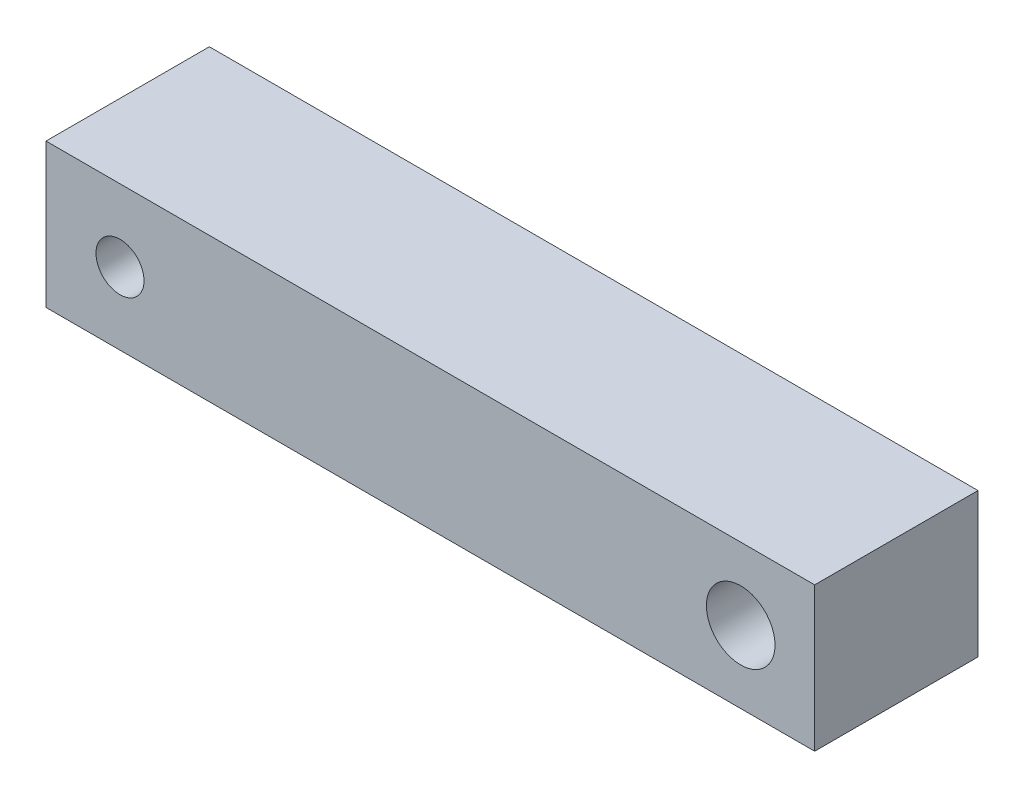
ISO-10303-21;
HEADER;
FILE_DESCRIPTION(('STEP AP214'),'2;1');
FILE_NAME('part.step','',(''),(''),'','','');
FILE_SCHEMA(('AUTOMOTIVE_DESIGN { 1 0 10303 214 1 1 1 1 }'));
ENDSEC;
DATA;
#1=APPLICATION_CONTEXT('core data for automotive mechanical design processes');
#2=APPLICATION_PROTOCOL_DEFINITION('international standard','automotive_design',2000,#1);
#3=PRODUCT_CONTEXT('',#1,'mechanical');
#4=PRODUCT('Part','Part','',(#3));
#5=PRODUCT_RELATED_PRODUCT_CATEGORY('part','',(#4));
#6=PRODUCT_DEFINITION_FORMATION('','',#4);
#7=PRODUCT_DEFINITION_CONTEXT('part definition',#1,'design');
#8=PRODUCT_DEFINITION('design','',#6,#7);
#9=PRODUCT_DEFINITION_SHAPE('','',#8);
#10=(LENGTH_UNIT() NAMED_UNIT(*) SI_UNIT(.MILLI.,.METRE.));
#11=(NAMED_UNIT(*) PLANE_ANGLE_UNIT() SI_UNIT($,.RADIAN.));
#12=(NAMED_UNIT(*) SI_UNIT($,.STERADIAN.) SOLID_ANGLE_UNIT());
#13=UNCERTAINTY_MEASURE_WITH_UNIT(LENGTH_MEASURE(1.E-05),#10,'distance_accuracy_value','');
#14=(GEOMETRIC_REPRESENTATION_CONTEXT(3) GLOBAL_UNCERTAINTY_ASSIGNED_CONTEXT((#13)) GLOBAL_UNIT_ASSIGNED_CONTEXT((#10,
#11,#12)) REPRESENTATION_CONTEXT('',''));
#15=CARTESIAN_POINT('',(0.,0.,0.));
#16=DIRECTION('',(0.,0.,1.));
#17=DIRECTION('',(1.,0.,0.));
#18=AXIS2_PLACEMENT_3D('',#15,#16,#17);
#19=CARTESIAN_POINT('',(0.,0.,27.));
#20=DIRECTION('',(0.,0.,-1.));
#21=DIRECTION('',(-1.,0.,0.));
#22=AXIS2_PLACEMENT_3D('',#19,#20,#21);
#23=PLANE('',#22);
#24=CARTESIAN_POINT('',(32.2999999999999,33.2308654605128,27.));
#25=DIRECTION('',(0.,0.,1.));
#26=DIRECTION('',(1.,0.,0.));
#27=AXIS2_PLACEMENT_3D('',#24,#25,#26);
#28=CIRCLE('',#27,3.57);
#29=CARTESIAN_POINT('',(35.8699999999999,33.2308654605128,27.));
#30=VERTEX_POINT('',#29);
#31=EDGE_CURVE('E100',#30,#30,#28,.T.);
#32=ORIENTED_EDGE('',*,*,#31,.F.);
#33=EDGE_LOOP('',(#32));
#34=FACE_BOUND('',#33,.T.);
#35=DIRECTION('',(0.,-1.,0.));
#36=VECTOR('',#35,1.);
#37=CARTESIAN_POINT('',(-40.,40.7308656022897,27.));
#38=LINE('',#37,#36);
#39=CARTESIAN_POINT('',(-40.,40.7308656022897,27.));
#40=VERTEX_POINT('',#39);
#41=CARTESIAN_POINT('',(-40.,25.7308656022897,27.));
#42=VERTEX_POINT('',#41);
#43=EDGE_CURVE('E85',#40,#42,#38,.T.);
#44=ORIENTED_EDGE('',*,*,#43,.T.);
#45=DIRECTION('',(1.,0.,0.));
#46=VECTOR('',#45,1.);
#47=CARTESIAN_POINT('',(40.,25.7308656022897,27.));
#48=LINE('',#47,#46);
#49=CARTESIAN_POINT('',(40.,25.7308656022897,27.));
#50=VERTEX_POINT('',#49);
#51=EDGE_CURVE('E80',#42,#50,#48,.T.);
#52=ORIENTED_EDGE('',*,*,#51,.T.);
#53=DIRECTION('',(0.,1.,0.));
#54=VECTOR('',#53,1.);
#55=CARTESIAN_POINT('',(40.,40.7308656022897,27.));
#56=LINE('',#55,#54);
#57=CARTESIAN_POINT('',(40.,40.7308656022897,27.));
#58=VERTEX_POINT('',#57);
#59=EDGE_CURVE('E83',#50,#58,#56,.T.);
#60=ORIENTED_EDGE('',*,*,#59,.T.);
#61=DIRECTION('',(-1.,0.,0.));
#62=VECTOR('',#61,1.);
#63=CARTESIAN_POINT('',(40.,40.7308656022897,27.));
#64=LINE('',#63,#62);
#65=EDGE_CURVE('E50',#58,#40,#64,.T.);
#66=ORIENTED_EDGE('',*,*,#65,.T.);
#67=EDGE_LOOP('',(#44,#52,#60,#66));
#68=FACE_BOUND('',#67,.T.);
#69=CARTESIAN_POINT('',(-32.2999999999999,33.2308657440666,27.));
#70=DIRECTION('',(0.,0.,1.));
#71=DIRECTION('',(1.,0.,0.));
#72=AXIS2_PLACEMENT_3D('',#69,#70,#71);
#73=CIRCLE('',#72,2.5);
#74=CARTESIAN_POINT('',(-29.7999999999999,33.2308657440666,27.));
#75=VERTEX_POINT('',#74);
#76=EDGE_CURVE('E115',#75,#75,#73,.T.);
#77=ORIENTED_EDGE('',*,*,#76,.F.);
#78=EDGE_LOOP('',(#77));
#79=FACE_BOUND('',#78,.T.);
#80=ADVANCED_FACE('F33',(#34,#68,#79),#23,.F.);
#81=CARTESIAN_POINT('',(0.,0.,10.));
#82=DIRECTION('',(0.,0.,-1.));
#83=DIRECTION('',(-1.,0.,0.));
#84=AXIS2_PLACEMENT_3D('',#81,#82,#83);
#85=PLANE('',#84);
#86=CARTESIAN_POINT('',(32.2999999999999,33.2308654605128,10.));
#87=DIRECTION('',(0.,0.,1.));
#88=DIRECTION('',(1.,0.,0.));
#89=AXIS2_PLACEMENT_3D('',#86,#87,#88);
#90=CIRCLE('',#89,3.57);
#91=CARTESIAN_POINT('',(35.8699999999999,33.2308654605128,10.));
#92=VERTEX_POINT('',#91);
#93=EDGE_CURVE('E112',#92,#92,#90,.T.);
#94=ORIENTED_EDGE('',*,*,#93,.T.);
#95=EDGE_LOOP('',(#94));
#96=FACE_BOUND('',#95,.T.);
#97=DIRECTION('',(0.,-1.,0.));
#98=VECTOR('',#97,1.);
#99=CARTESIAN_POINT('',(-40.,40.7308656022897,10.));
#100=LINE('',#99,#98);
#101=CARTESIAN_POINT('',(-40.,40.7308656022897,10.));
#102=VERTEX_POINT('',#101);
#103=CARTESIAN_POINT('',(-40.,25.7308656022897,10.));
#104=VERTEX_POINT('',#103);
#105=EDGE_CURVE('E97',#102,#104,#100,.T.);
#106=ORIENTED_EDGE('',*,*,#105,.F.);
#107=DIRECTION('',(-1.,0.,0.));
#108=VECTOR('',#107,1.);
#109=CARTESIAN_POINT('',(40.,40.7308656022897,10.));
#110=LINE('',#109,#108);
#111=CARTESIAN_POINT('',(40.,40.7308656022897,10.));
#112=VERTEX_POINT('',#111);
#113=EDGE_CURVE('E73',#112,#102,#110,.T.);
#114=ORIENTED_EDGE('',*,*,#113,.F.);
#115=DIRECTION('',(0.,1.,0.));
#116=VECTOR('',#115,1.);
#117=CARTESIAN_POINT('',(40.,40.7308656022897,10.));
#118=LINE('',#117,#116);
#119=CARTESIAN_POINT('',(40.,25.7308656022897,10.));
#120=VERTEX_POINT('',#119);
#121=EDGE_CURVE('E67',#120,#112,#118,.T.);
#122=ORIENTED_EDGE('',*,*,#121,.F.);
#123=DIRECTION('',(1.,0.,0.));
#124=VECTOR('',#123,1.);
#125=CARTESIAN_POINT('',(40.,25.7308656022897,10.));
#126=LINE('',#125,#124);
#127=EDGE_CURVE('E89',#104,#120,#126,.T.);
#128=ORIENTED_EDGE('',*,*,#127,.F.);
#129=EDGE_LOOP('',(#106,#114,#122,#128));
#130=FACE_BOUND('',#129,.T.);
#131=CARTESIAN_POINT('',(-32.2999999999999,33.2308657440666,10.));
#132=DIRECTION('',(0.,0.,1.));
#133=DIRECTION('',(1.,0.,0.));
#134=AXIS2_PLACEMENT_3D('',#131,#132,#133);
#135=CIRCLE('',#134,2.5);
#136=CARTESIAN_POINT('',(-29.7999999999999,33.2308657440666,10.));
#137=VERTEX_POINT('',#136);
#138=EDGE_CURVE('E118',#137,#137,#135,.T.);
#139=ORIENTED_EDGE('',*,*,#138,.T.);
#140=EDGE_LOOP('',(#139));
#141=FACE_BOUND('',#140,.T.);
#142=ADVANCED_FACE('F108',(#96,#130,#141),#85,.T.);
#143=CARTESIAN_POINT('',(-40.,40.7308656022897,27.));
#144=DIRECTION('',(1.,0.,0.));
#145=DIRECTION('',(0.,0.,-1.));
#146=AXIS2_PLACEMENT_3D('',#143,#144,#145);
#147=PLANE('',#146);
#148=ORIENTED_EDGE('',*,*,#105,.T.);
#149=DIRECTION('',(0.,0.,-1.));
#150=VECTOR('',#149,1.);
#151=CARTESIAN_POINT('',(-40.,25.7308656022897,27.));
#152=LINE('',#151,#150);
#153=EDGE_CURVE('E11',#42,#104,#152,.T.);
#154=ORIENTED_EDGE('',*,*,#153,.F.);
#155=ORIENTED_EDGE('',*,*,#43,.F.);
#156=DIRECTION('',(0.,0.,-1.));
#157=VECTOR('',#156,1.);
#158=CARTESIAN_POINT('',(-40.,40.7308656022897,27.));
#159=LINE('',#158,#157);
#160=EDGE_CURVE('E93',#40,#102,#159,.T.);
#161=ORIENTED_EDGE('',*,*,#160,.T.);
#162=EDGE_LOOP('',(#148,#154,#155,#161));
#163=FACE_BOUND('',#162,.T.);
#164=ADVANCED_FACE('F35',(#163),#147,.F.);
#165=CARTESIAN_POINT('',(40.,25.7308656022897,27.));
#166=DIRECTION('',(0.,1.,0.));
#167=DIRECTION('',(-1.,0.,0.));
#168=AXIS2_PLACEMENT_3D('',#165,#166,#167);
#169=PLANE('',#168);
#170=ORIENTED_EDGE('',*,*,#127,.T.);
#171=DIRECTION('',(0.,0.,-1.));
#172=VECTOR('',#171,1.);
#173=CARTESIAN_POINT('',(40.,25.7308656022897,27.));
#174=LINE('',#173,#172);
#175=EDGE_CURVE('E42',#50,#120,#174,.T.);
#176=ORIENTED_EDGE('',*,*,#175,.F.);
#177=ORIENTED_EDGE('',*,*,#51,.F.);
#178=ORIENTED_EDGE('',*,*,#153,.T.);
#179=EDGE_LOOP('',(#170,#176,#177,#178));
#180=FACE_BOUND('',#179,.T.);
#181=ADVANCED_FACE('F88',(#180),#169,.F.);
#182=CARTESIAN_POINT('',(40.,40.7308656022897,27.));
#183=DIRECTION('',(-1.,0.,0.));
#184=DIRECTION('',(0.,0.,1.));
#185=AXIS2_PLACEMENT_3D('',#182,#183,#184);
#186=PLANE('',#185);
#187=ORIENTED_EDGE('',*,*,#121,.T.);
#188=DIRECTION('',(0.,0.,-1.));
#189=VECTOR('',#188,1.);
#190=CARTESIAN_POINT('',(40.,40.7308656022897,27.));
#191=LINE('',#190,#189);
#192=EDGE_CURVE('E90',#58,#112,#191,.T.);
#193=ORIENTED_EDGE('',*,*,#192,.F.);
#194=ORIENTED_EDGE('',*,*,#59,.F.);
#195=ORIENTED_EDGE('',*,*,#175,.T.);
#196=EDGE_LOOP('',(#187,#193,#194,#195));
#197=FACE_BOUND('',#196,.T.);
#198=ADVANCED_FACE('F91',(#197),#186,.F.);
#199=CARTESIAN_POINT('',(40.,40.7308656022897,27.));
#200=DIRECTION('',(0.,-1.,0.));
#201=DIRECTION('',(1.,0.,0.));
#202=AXIS2_PLACEMENT_3D('',#199,#200,#201);
#203=PLANE('',#202);
#204=ORIENTED_EDGE('',*,*,#113,.T.);
#205=ORIENTED_EDGE('',*,*,#160,.F.);
#206=ORIENTED_EDGE('',*,*,#65,.F.);
#207=ORIENTED_EDGE('',*,*,#192,.T.);
#208=EDGE_LOOP('',(#204,#205,#206,#207));
#209=FACE_BOUND('',#208,.T.);
#210=ADVANCED_FACE('F105',(#209),#203,.F.);
#211=CARTESIAN_POINT('',(32.2999999999999,33.2308654605128,27.));
#212=DIRECTION('',(0.,0.,-1.));
#213=DIRECTION('',(-1.,0.,0.));
#214=AXIS2_PLACEMENT_3D('',#211,#212,#213);
#215=CYLINDRICAL_SURFACE('',#214,3.57);
#216=ORIENTED_EDGE('',*,*,#31,.T.);
#217=EDGE_LOOP('',(#216));
#218=FACE_BOUND('',#217,.T.);
#219=ORIENTED_EDGE('',*,*,#93,.F.);
#220=EDGE_LOOP('',(#219));
#221=FACE_BOUND('',#220,.T.);
#222=ADVANCED_FACE('F136',(#218,#221),#215,.F.);
#223=CARTESIAN_POINT('',(-32.2999999999999,33.2308657440666,27.));
#224=DIRECTION('',(0.,0.,-1.));
#225=DIRECTION('',(-1.,0.,0.));
#226=AXIS2_PLACEMENT_3D('',#223,#224,#225);
#227=CYLINDRICAL_SURFACE('',#226,2.5);
#228=ORIENTED_EDGE('',*,*,#76,.T.);
#229=EDGE_LOOP('',(#228));
#230=FACE_BOUND('',#229,.T.);
#231=ORIENTED_EDGE('',*,*,#138,.F.);
#232=EDGE_LOOP('',(#231));
#233=FACE_BOUND('',#232,.T.);
#234=ADVANCED_FACE('F124',(#230,#233),#227,.F.);
#235=CLOSED_SHELL('',(#80,#142,#164,#181,#198,#210,#222,#234));
#236=MANIFOLD_SOLID_BREP('B2',#235);
#237=ADVANCED_BREP_SHAPE_REPRESENTATION('',(#18,#236),#14);
#238=SHAPE_DEFINITION_REPRESENTATION(#9,#237);
ENDSEC;
END-ISO-10303-21;
